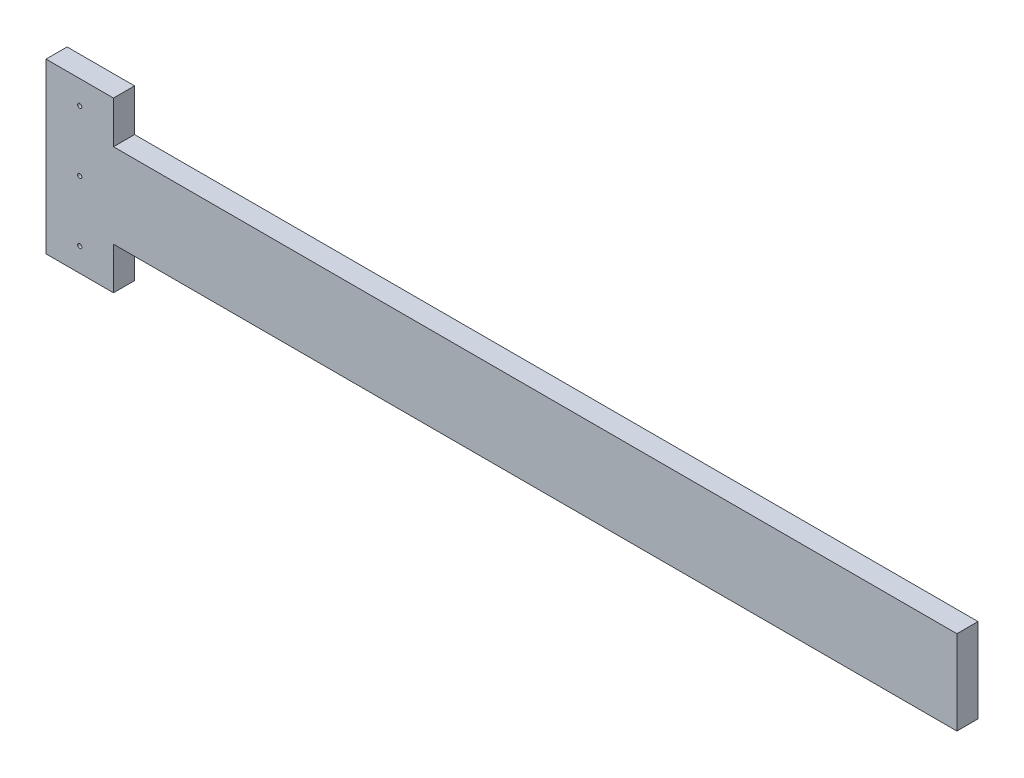
ISO-10303-21;
HEADER;
FILE_DESCRIPTION(('STEP AP214'),'2;1');
FILE_NAME('part.step','',(''),(''),'','','');
FILE_SCHEMA(('AUTOMOTIVE_DESIGN { 1 0 10303 214 1 1 1 1 }'));
ENDSEC;
DATA;
#1=APPLICATION_CONTEXT('core data for automotive mechanical design processes');
#2=APPLICATION_PROTOCOL_DEFINITION('international standard','automotive_design',2000,#1);
#3=PRODUCT_CONTEXT('',#1,'mechanical');
#4=PRODUCT('Part','Part','',(#3));
#5=PRODUCT_RELATED_PRODUCT_CATEGORY('part','',(#4));
#6=PRODUCT_DEFINITION_FORMATION('','',#4);
#7=PRODUCT_DEFINITION_CONTEXT('part definition',#1,'design');
#8=PRODUCT_DEFINITION('design','',#6,#7);
#9=PRODUCT_DEFINITION_SHAPE('','',#8);
#10=(LENGTH_UNIT() NAMED_UNIT(*) SI_UNIT(.MILLI.,.METRE.));
#11=(NAMED_UNIT(*) PLANE_ANGLE_UNIT() SI_UNIT($,.RADIAN.));
#12=(NAMED_UNIT(*) SI_UNIT($,.STERADIAN.) SOLID_ANGLE_UNIT());
#13=UNCERTAINTY_MEASURE_WITH_UNIT(LENGTH_MEASURE(1.E-05),#10,'distance_accuracy_value','');
#14=(GEOMETRIC_REPRESENTATION_CONTEXT(3) GLOBAL_UNCERTAINTY_ASSIGNED_CONTEXT((#13)) GLOBAL_UNIT_ASSIGNED_CONTEXT((#10,
#11,#12)) REPRESENTATION_CONTEXT('',''));
#15=CARTESIAN_POINT('',(0.,0.,0.));
#16=DIRECTION('',(0.,0.,1.));
#17=DIRECTION('',(1.,0.,0.));
#18=AXIS2_PLACEMENT_3D('',#15,#16,#17);
#19=CARTESIAN_POINT('',(0.,0.,6.35));
#20=DIRECTION('',(1.,0.,0.));
#21=DIRECTION('',(0.,0.,-1.));
#22=AXIS2_PLACEMENT_3D('',#19,#20,#21);
#23=PLANE('',#22);
#24=DIRECTION('',(0.,-1.,0.));
#25=VECTOR('',#24,1.);
#26=CARTESIAN_POINT('',(0.,0.,0.));
#27=LINE('',#26,#25);
#28=CARTESIAN_POINT('',(0.,50.8,0.));
#29=VERTEX_POINT('',#28);
#30=CARTESIAN_POINT('',(0.,0.,0.));
#31=VERTEX_POINT('',#30);
#32=EDGE_CURVE('E135',#29,#31,#27,.T.);
#33=ORIENTED_EDGE('',*,*,#32,.T.);
#34=DIRECTION('',(0.,0.,-1.));
#35=VECTOR('',#34,1.);
#36=CARTESIAN_POINT('',(0.,0.,6.35));
#37=LINE('',#36,#35);
#38=CARTESIAN_POINT('',(0.,0.,6.35));
#39=VERTEX_POINT('',#38);
#40=EDGE_CURVE('E11',#39,#31,#37,.T.);
#41=ORIENTED_EDGE('',*,*,#40,.F.);
#42=DIRECTION('',(0.,-1.,0.));
#43=VECTOR('',#42,1.);
#44=CARTESIAN_POINT('',(0.,0.,6.35));
#45=LINE('',#44,#43);
#46=CARTESIAN_POINT('',(0.,50.8,6.35));
#47=VERTEX_POINT('',#46);
#48=EDGE_CURVE('E150',#47,#39,#45,.T.);
#49=ORIENTED_EDGE('',*,*,#48,.F.);
#50=DIRECTION('',(0.,0.,-1.));
#51=VECTOR('',#50,1.);
#52=CARTESIAN_POINT('',(0.,50.8,6.35));
#53=LINE('',#52,#51);
#54=EDGE_CURVE('E131',#47,#29,#53,.T.);
#55=ORIENTED_EDGE('',*,*,#54,.T.);
#56=EDGE_LOOP('',(#33,#41,#49,#55));
#57=FACE_BOUND('',#56,.T.);
#58=ADVANCED_FACE('F39',(#57),#23,.F.);
#59=CARTESIAN_POINT('',(0.,0.,6.35));
#60=DIRECTION('',(0.,1.,0.));
#61=DIRECTION('',(0.,0.,1.));
#62=AXIS2_PLACEMENT_3D('',#59,#60,#61);
#63=PLANE('',#62);
#64=DIRECTION('',(1.,0.,0.));
#65=VECTOR('',#64,1.);
#66=CARTESIAN_POINT('',(0.,0.,0.));
#67=LINE('',#66,#65);
#68=CARTESIAN_POINT('',(20.32,0.,0.));
#69=VERTEX_POINT('',#68);
#70=EDGE_CURVE('E138',#31,#69,#67,.T.);
#71=ORIENTED_EDGE('',*,*,#70,.T.);
#72=DIRECTION('',(0.,0.,-1.));
#73=VECTOR('',#72,1.);
#74=CARTESIAN_POINT('',(20.32,0.,6.35));
#75=LINE('',#74,#73);
#76=CARTESIAN_POINT('',(20.32,0.,6.35));
#77=VERTEX_POINT('',#76);
#78=EDGE_CURVE('E47',#77,#69,#75,.T.);
#79=ORIENTED_EDGE('',*,*,#78,.F.);
#80=DIRECTION('',(1.,0.,0.));
#81=VECTOR('',#80,1.);
#82=CARTESIAN_POINT('',(0.,0.,6.35));
#83=LINE('',#82,#81);
#84=EDGE_CURVE('E98',#39,#77,#83,.T.);
#85=ORIENTED_EDGE('',*,*,#84,.F.);
#86=ORIENTED_EDGE('',*,*,#40,.T.);
#87=EDGE_LOOP('',(#71,#79,#85,#86));
#88=FACE_BOUND('',#87,.T.);
#89=ADVANCED_FACE('F231',(#88),#63,.F.);
#90=CARTESIAN_POINT('',(20.32,0.,6.35));
#91=DIRECTION('',(-1.,0.,0.));
#92=DIRECTION('',(0.,-1.,0.));
#93=AXIS2_PLACEMENT_3D('',#90,#91,#92);
#94=PLANE('',#93);
#95=DIRECTION('',(0.,1.,0.));
#96=VECTOR('',#95,1.);
#97=CARTESIAN_POINT('',(20.32,0.,0.));
#98=LINE('',#97,#96);
#99=CARTESIAN_POINT('',(20.32,12.7,0.));
#100=VERTEX_POINT('',#99);
#101=EDGE_CURVE('E141',#69,#100,#98,.T.);
#102=ORIENTED_EDGE('',*,*,#101,.T.);
#103=DIRECTION('',(0.,0.,-1.));
#104=VECTOR('',#103,1.);
#105=CARTESIAN_POINT('',(20.32,12.7,6.35));
#106=LINE('',#105,#104);
#107=CARTESIAN_POINT('',(20.32,12.7,6.35));
#108=VERTEX_POINT('',#107);
#109=EDGE_CURVE('E157',#108,#100,#106,.T.);
#110=ORIENTED_EDGE('',*,*,#109,.F.);
#111=DIRECTION('',(0.,1.,0.));
#112=VECTOR('',#111,1.);
#113=CARTESIAN_POINT('',(20.32,0.,6.35));
#114=LINE('',#113,#112);
#115=EDGE_CURVE('E165',#77,#108,#114,.T.);
#116=ORIENTED_EDGE('',*,*,#115,.F.);
#117=ORIENTED_EDGE('',*,*,#78,.T.);
#118=EDGE_LOOP('',(#102,#110,#116,#117));
#119=FACE_BOUND('',#118,.T.);
#120=ADVANCED_FACE('F163',(#119),#94,.F.);
#121=CARTESIAN_POINT('',(20.32,12.7,6.35));
#122=DIRECTION('',(0.,1.,0.));
#123=DIRECTION('',(0.,0.,1.));
#124=AXIS2_PLACEMENT_3D('',#121,#122,#123);
#125=PLANE('',#124);
#126=DIRECTION('',(1.,0.,0.));
#127=VECTOR('',#126,1.);
#128=CARTESIAN_POINT('',(20.32,12.7,0.));
#129=LINE('',#128,#127);
#130=CARTESIAN_POINT('',(274.32,12.7,0.));
#131=VERTEX_POINT('',#130);
#132=EDGE_CURVE('E143',#100,#131,#129,.T.);
#133=ORIENTED_EDGE('',*,*,#132,.T.);
#134=DIRECTION('',(0.,0.,-1.));
#135=VECTOR('',#134,1.);
#136=CARTESIAN_POINT('',(274.32,12.7,6.35));
#137=LINE('',#136,#135);
#138=CARTESIAN_POINT('',(274.32,12.7,6.35));
#139=VERTEX_POINT('',#138);
#140=EDGE_CURVE('E154',#139,#131,#137,.T.);
#141=ORIENTED_EDGE('',*,*,#140,.F.);
#142=DIRECTION('',(1.,0.,0.));
#143=VECTOR('',#142,1.);
#144=CARTESIAN_POINT('',(20.32,12.7,6.35));
#145=LINE('',#144,#143);
#146=EDGE_CURVE('E177',#108,#139,#145,.T.);
#147=ORIENTED_EDGE('',*,*,#146,.F.);
#148=ORIENTED_EDGE('',*,*,#109,.T.);
#149=EDGE_LOOP('',(#133,#141,#147,#148));
#150=FACE_BOUND('',#149,.T.);
#151=ADVANCED_FACE('F173',(#150),#125,.F.);
#152=CARTESIAN_POINT('',(274.32,38.1,6.35));
#153=DIRECTION('',(-1.,0.,0.));
#154=DIRECTION('',(0.,0.,1.));
#155=AXIS2_PLACEMENT_3D('',#152,#153,#154);
#156=PLANE('',#155);
#157=DIRECTION('',(0.,1.,0.));
#158=VECTOR('',#157,1.);
#159=CARTESIAN_POINT('',(274.32,38.1,0.));
#160=LINE('',#159,#158);
#161=CARTESIAN_POINT('',(274.32,38.1,0.));
#162=VERTEX_POINT('',#161);
#163=EDGE_CURVE('E145',#131,#162,#160,.T.);
#164=ORIENTED_EDGE('',*,*,#163,.T.);
#165=DIRECTION('',(0.,0.,-1.));
#166=VECTOR('',#165,1.);
#167=CARTESIAN_POINT('',(274.32,38.1,6.35));
#168=LINE('',#167,#166);
#169=CARTESIAN_POINT('',(274.32,38.1,6.35));
#170=VERTEX_POINT('',#169);
#171=EDGE_CURVE('E126',#170,#162,#168,.T.);
#172=ORIENTED_EDGE('',*,*,#171,.F.);
#173=DIRECTION('',(0.,1.,0.));
#174=VECTOR('',#173,1.);
#175=CARTESIAN_POINT('',(274.32,38.1,6.35));
#176=LINE('',#175,#174);
#177=EDGE_CURVE('E117',#139,#170,#176,.T.);
#178=ORIENTED_EDGE('',*,*,#177,.F.);
#179=ORIENTED_EDGE('',*,*,#140,.T.);
#180=EDGE_LOOP('',(#164,#172,#178,#179));
#181=FACE_BOUND('',#180,.T.);
#182=ADVANCED_FACE('F176',(#181),#156,.F.);
#183=CARTESIAN_POINT('',(20.32,38.1,6.35));
#184=DIRECTION('',(0.,-1.,0.));
#185=DIRECTION('',(0.,0.,-1.));
#186=AXIS2_PLACEMENT_3D('',#183,#184,#185);
#187=PLANE('',#186);
#188=DIRECTION('',(-1.,0.,0.));
#189=VECTOR('',#188,1.);
#190=CARTESIAN_POINT('',(20.32,38.1,0.));
#191=LINE('',#190,#189);
#192=CARTESIAN_POINT('',(20.32,38.1,0.));
#193=VERTEX_POINT('',#192);
#194=EDGE_CURVE('E125',#162,#193,#191,.T.);
#195=ORIENTED_EDGE('',*,*,#194,.T.);
#196=DIRECTION('',(0.,0.,-1.));
#197=VECTOR('',#196,1.);
#198=CARTESIAN_POINT('',(20.32,38.1,6.35));
#199=LINE('',#198,#197);
#200=CARTESIAN_POINT('',(20.32,38.1,6.35));
#201=VERTEX_POINT('',#200);
#202=EDGE_CURVE('E122',#201,#193,#199,.T.);
#203=ORIENTED_EDGE('',*,*,#202,.F.);
#204=DIRECTION('',(-1.,0.,0.));
#205=VECTOR('',#204,1.);
#206=CARTESIAN_POINT('',(20.32,38.1,6.35));
#207=LINE('',#206,#205);
#208=EDGE_CURVE('E111',#170,#201,#207,.T.);
#209=ORIENTED_EDGE('',*,*,#208,.F.);
#210=ORIENTED_EDGE('',*,*,#171,.T.);
#211=EDGE_LOOP('',(#195,#203,#209,#210));
#212=FACE_BOUND('',#211,.T.);
#213=ADVANCED_FACE('F123',(#212),#187,.F.);
#214=CARTESIAN_POINT('',(20.32,38.1,6.35));
#215=DIRECTION('',(-1.,0.,0.));
#216=DIRECTION('',(0.,-1.,0.));
#217=AXIS2_PLACEMENT_3D('',#214,#215,#216);
#218=PLANE('',#217);
#219=DIRECTION('',(0.,1.,0.));
#220=VECTOR('',#219,1.);
#221=CARTESIAN_POINT('',(20.32,38.1,0.));
#222=LINE('',#221,#220);
#223=CARTESIAN_POINT('',(20.32,50.8,0.));
#224=VERTEX_POINT('',#223);
#225=EDGE_CURVE('E84',#193,#224,#222,.T.);
#226=ORIENTED_EDGE('',*,*,#225,.T.);
#227=DIRECTION('',(0.,0.,-1.));
#228=VECTOR('',#227,1.);
#229=CARTESIAN_POINT('',(20.32,50.8,6.35));
#230=LINE('',#229,#228);
#231=CARTESIAN_POINT('',(20.32,50.8,6.35));
#232=VERTEX_POINT('',#231);
#233=EDGE_CURVE('E127',#232,#224,#230,.T.);
#234=ORIENTED_EDGE('',*,*,#233,.F.);
#235=DIRECTION('',(0.,1.,0.));
#236=VECTOR('',#235,1.);
#237=CARTESIAN_POINT('',(20.32,38.1,6.35));
#238=LINE('',#237,#236);
#239=EDGE_CURVE('E115',#201,#232,#238,.T.);
#240=ORIENTED_EDGE('',*,*,#239,.F.);
#241=ORIENTED_EDGE('',*,*,#202,.T.);
#242=EDGE_LOOP('',(#226,#234,#240,#241));
#243=FACE_BOUND('',#242,.T.);
#244=ADVANCED_FACE('F129',(#243),#218,.F.);
#245=CARTESIAN_POINT('',(0.,50.8,6.35));
#246=DIRECTION('',(0.,-1.,0.));
#247=DIRECTION('',(1.,0.,0.));
#248=AXIS2_PLACEMENT_3D('',#245,#246,#247);
#249=PLANE('',#248);
#250=DIRECTION('',(-1.,0.,0.));
#251=VECTOR('',#250,1.);
#252=CARTESIAN_POINT('',(0.,50.8,0.));
#253=LINE('',#252,#251);
#254=EDGE_CURVE('E90',#224,#29,#253,.T.);
#255=ORIENTED_EDGE('',*,*,#254,.T.);
#256=ORIENTED_EDGE('',*,*,#54,.F.);
#257=DIRECTION('',(-1.,0.,0.));
#258=VECTOR('',#257,1.);
#259=CARTESIAN_POINT('',(0.,50.8,6.35));
#260=LINE('',#259,#258);
#261=EDGE_CURVE('E55',#232,#47,#260,.T.);
#262=ORIENTED_EDGE('',*,*,#261,.F.);
#263=ORIENTED_EDGE('',*,*,#233,.T.);
#264=EDGE_LOOP('',(#255,#256,#262,#263));
#265=FACE_BOUND('',#264,.T.);
#266=ADVANCED_FACE('F212',(#265),#249,.F.);
#267=CARTESIAN_POINT('',(0.,0.,6.35));
#268=DIRECTION('',(0.,0.,-1.));
#269=DIRECTION('',(-1.,0.,0.));
#270=AXIS2_PLACEMENT_3D('',#267,#268,#269);
#271=PLANE('',#270);
#272=CARTESIAN_POINT('',(10.16,43.688,6.35));
#273=DIRECTION('',(0.,0.,-1.));
#274=DIRECTION('',(-1.,0.,0.));
#275=AXIS2_PLACEMENT_3D('',#272,#273,#274);
#276=CIRCLE('',#275,0.635000000000004);
#277=CARTESIAN_POINT('',(9.525,43.688,6.35));
#278=VERTEX_POINT('',#277);
#279=EDGE_CURVE('E139',#278,#278,#276,.T.);
#280=ORIENTED_EDGE('',*,*,#279,.T.);
#281=EDGE_LOOP('',(#280));
#282=FACE_BOUND('',#281,.T.);
#283=CARTESIAN_POINT('',(10.16,25.4,6.35));
#284=DIRECTION('',(0.,0.,-1.));
#285=DIRECTION('',(-1.,0.,0.));
#286=AXIS2_PLACEMENT_3D('',#283,#284,#285);
#287=CIRCLE('',#286,0.635);
#288=CARTESIAN_POINT('',(9.525,25.4,6.35));
#289=VERTEX_POINT('',#288);
#290=EDGE_CURVE('E185',#289,#289,#287,.T.);
#291=ORIENTED_EDGE('',*,*,#290,.T.);
#292=EDGE_LOOP('',(#291));
#293=FACE_BOUND('',#292,.T.);
#294=CARTESIAN_POINT('',(10.16,7.112,6.35));
#295=DIRECTION('',(0.,0.,-1.));
#296=DIRECTION('',(-1.,0.,0.));
#297=AXIS2_PLACEMENT_3D('',#294,#295,#296);
#298=CIRCLE('',#297,0.635000000000001);
#299=CARTESIAN_POINT('',(9.52500000000001,7.112,6.35));
#300=VERTEX_POINT('',#299);
#301=EDGE_CURVE('E188',#300,#300,#298,.T.);
#302=ORIENTED_EDGE('',*,*,#301,.T.);
#303=EDGE_LOOP('',(#302));
#304=FACE_BOUND('',#303,.T.);
#305=ORIENTED_EDGE('',*,*,#48,.T.);
#306=ORIENTED_EDGE('',*,*,#84,.T.);
#307=ORIENTED_EDGE('',*,*,#115,.T.);
#308=ORIENTED_EDGE('',*,*,#146,.T.);
#309=ORIENTED_EDGE('',*,*,#177,.T.);
#310=ORIENTED_EDGE('',*,*,#208,.T.);
#311=ORIENTED_EDGE('',*,*,#239,.T.);
#312=ORIENTED_EDGE('',*,*,#261,.T.);
#313=EDGE_LOOP('',(#305,#306,#307,#308,#309,#310,#311,#312));
#314=FACE_BOUND('',#313,.T.);
#315=ADVANCED_FACE('F113',(#282,#293,#304,#314),#271,.F.);
#316=CARTESIAN_POINT('',(0.,0.,0.));
#317=DIRECTION('',(0.,0.,-1.));
#318=DIRECTION('',(-1.,0.,0.));
#319=AXIS2_PLACEMENT_3D('',#316,#317,#318);
#320=PLANE('',#319);
#321=CARTESIAN_POINT('',(10.16,43.688,0.));
#322=DIRECTION('',(0.,0.,1.));
#323=DIRECTION('',(1.,0.,0.));
#324=AXIS2_PLACEMENT_3D('',#321,#322,#323);
#325=CIRCLE('',#324,0.635000000000004);
#326=CARTESIAN_POINT('',(10.795,43.688,0.));
#327=VERTEX_POINT('',#326);
#328=EDGE_CURVE('E191',#327,#327,#325,.T.);
#329=ORIENTED_EDGE('',*,*,#328,.T.);
#330=EDGE_LOOP('',(#329));
#331=FACE_BOUND('',#330,.T.);
#332=CARTESIAN_POINT('',(10.16,25.4,0.));
#333=DIRECTION('',(0.,0.,1.));
#334=DIRECTION('',(1.,0.,0.));
#335=AXIS2_PLACEMENT_3D('',#332,#333,#334);
#336=CIRCLE('',#335,0.635);
#337=CARTESIAN_POINT('',(10.795,25.4,0.));
#338=VERTEX_POINT('',#337);
#339=EDGE_CURVE('E195',#338,#338,#336,.T.);
#340=ORIENTED_EDGE('',*,*,#339,.T.);
#341=EDGE_LOOP('',(#340));
#342=FACE_BOUND('',#341,.T.);
#343=CARTESIAN_POINT('',(10.16,7.112,0.));
#344=DIRECTION('',(0.,0.,1.));
#345=DIRECTION('',(1.,0.,0.));
#346=AXIS2_PLACEMENT_3D('',#343,#344,#345);
#347=CIRCLE('',#346,0.635000000000001);
#348=CARTESIAN_POINT('',(10.795,7.112,0.));
#349=VERTEX_POINT('',#348);
#350=EDGE_CURVE('E192',#349,#349,#347,.T.);
#351=ORIENTED_EDGE('',*,*,#350,.T.);
#352=EDGE_LOOP('',(#351));
#353=FACE_BOUND('',#352,.T.);
#354=ORIENTED_EDGE('',*,*,#32,.F.);
#355=ORIENTED_EDGE('',*,*,#254,.F.);
#356=ORIENTED_EDGE('',*,*,#225,.F.);
#357=ORIENTED_EDGE('',*,*,#194,.F.);
#358=ORIENTED_EDGE('',*,*,#163,.F.);
#359=ORIENTED_EDGE('',*,*,#132,.F.);
#360=ORIENTED_EDGE('',*,*,#101,.F.);
#361=ORIENTED_EDGE('',*,*,#70,.F.);
#362=EDGE_LOOP('',(#354,#355,#356,#357,#358,#359,#360,#361));
#363=FACE_BOUND('',#362,.T.);
#364=ADVANCED_FACE('F169',(#331,#342,#353,#363),#320,.T.);
#365=CARTESIAN_POINT('',(10.16,7.112,0.));
#366=DIRECTION('',(0.,0.,1.));
#367=DIRECTION('',(1.,0.,0.));
#368=AXIS2_PLACEMENT_3D('',#365,#366,#367);
#369=CYLINDRICAL_SURFACE('',#368,0.635000000000001);
#370=ORIENTED_EDGE('',*,*,#350,.F.);
#371=EDGE_LOOP('',(#370));
#372=FACE_BOUND('',#371,.T.);
#373=ORIENTED_EDGE('',*,*,#301,.F.);
#374=EDGE_LOOP('',(#373));
#375=FACE_BOUND('',#374,.T.);
#376=ADVANCED_FACE('F218',(#372,#375),#369,.F.);
#377=CARTESIAN_POINT('',(10.16,25.4,0.));
#378=DIRECTION('',(0.,0.,1.));
#379=DIRECTION('',(1.,0.,0.));
#380=AXIS2_PLACEMENT_3D('',#377,#378,#379);
#381=CYLINDRICAL_SURFACE('',#380,0.635);
#382=ORIENTED_EDGE('',*,*,#339,.F.);
#383=EDGE_LOOP('',(#382));
#384=FACE_BOUND('',#383,.T.);
#385=ORIENTED_EDGE('',*,*,#290,.F.);
#386=EDGE_LOOP('',(#385));
#387=FACE_BOUND('',#386,.T.);
#388=ADVANCED_FACE('F206',(#384,#387),#381,.F.);
#389=CARTESIAN_POINT('',(10.16,43.688,0.));
#390=DIRECTION('',(0.,0.,1.));
#391=DIRECTION('',(1.,0.,0.));
#392=AXIS2_PLACEMENT_3D('',#389,#390,#391);
#393=CYLINDRICAL_SURFACE('',#392,0.635000000000004);
#394=ORIENTED_EDGE('',*,*,#328,.F.);
#395=EDGE_LOOP('',(#394));
#396=FACE_BOUND('',#395,.T.);
#397=ORIENTED_EDGE('',*,*,#279,.F.);
#398=EDGE_LOOP('',(#397));
#399=FACE_BOUND('',#398,.T.);
#400=ADVANCED_FACE('F203',(#396,#399),#393,.F.);
#401=CLOSED_SHELL('',(#58,#89,#120,#151,#182,#213,#244,#266,#315,#364,#376,#388,#400));
#402=MANIFOLD_SOLID_BREP('B2',#401);
#403=ADVANCED_BREP_SHAPE_REPRESENTATION('',(#18,#402),#14);
#404=SHAPE_DEFINITION_REPRESENTATION(#9,#403);
ENDSEC;
END-ISO-10303-21;
